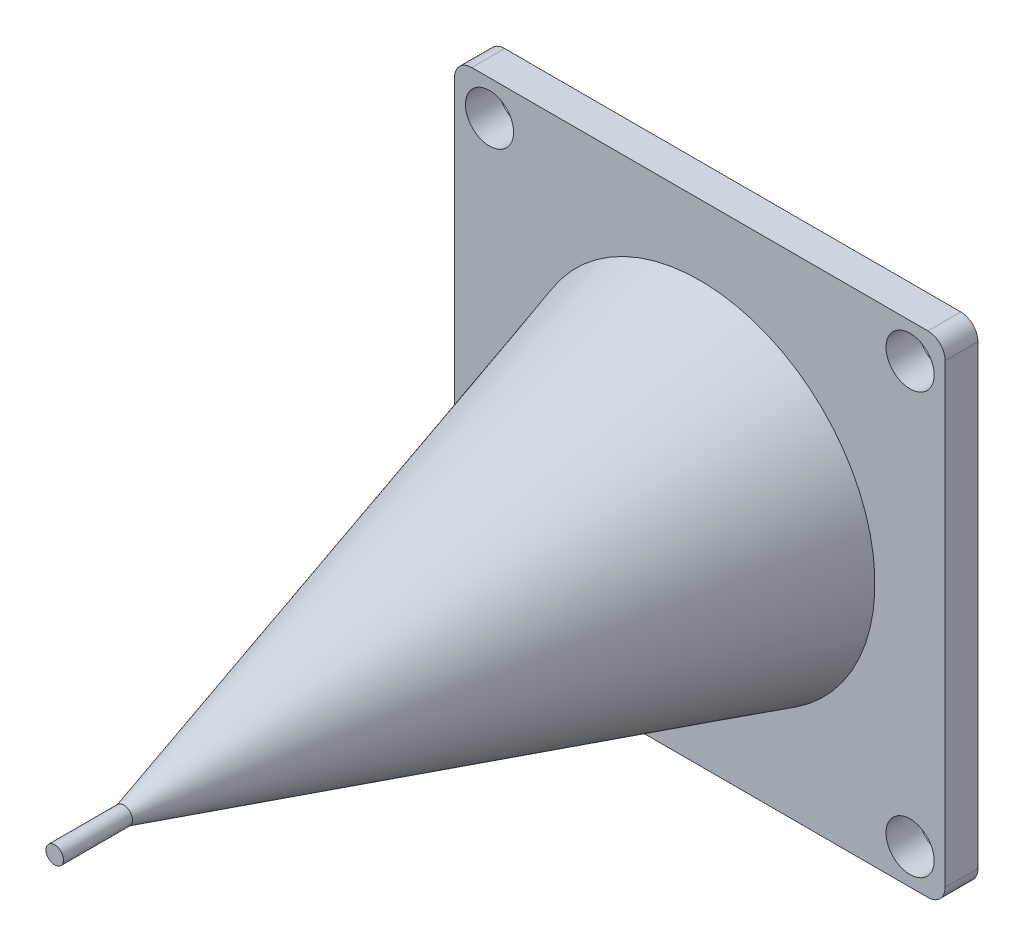
ISO-10303-21;
HEADER;
FILE_DESCRIPTION(('STEP AP214'),'2;1');
FILE_NAME('part.step','',(''),(''),'','','');
FILE_SCHEMA(('AUTOMOTIVE_DESIGN { 1 0 10303 214 1 1 1 1 }'));
ENDSEC;
DATA;
#1=APPLICATION_CONTEXT('core data for automotive mechanical design processes');
#2=APPLICATION_PROTOCOL_DEFINITION('international standard','automotive_design',2000,#1);
#3=PRODUCT_CONTEXT('',#1,'mechanical');
#4=PRODUCT('Part','Part','',(#3));
#5=PRODUCT_RELATED_PRODUCT_CATEGORY('part','',(#4));
#6=PRODUCT_DEFINITION_FORMATION('','',#4);
#7=PRODUCT_DEFINITION_CONTEXT('part definition',#1,'design');
#8=PRODUCT_DEFINITION('design','',#6,#7);
#9=PRODUCT_DEFINITION_SHAPE('','',#8);
#10=(LENGTH_UNIT() NAMED_UNIT(*) SI_UNIT(.MILLI.,.METRE.));
#11=(NAMED_UNIT(*) PLANE_ANGLE_UNIT() SI_UNIT($,.RADIAN.));
#12=(NAMED_UNIT(*) SI_UNIT($,.STERADIAN.) SOLID_ANGLE_UNIT());
#13=UNCERTAINTY_MEASURE_WITH_UNIT(LENGTH_MEASURE(1.E-05),#10,'distance_accuracy_value','');
#14=(GEOMETRIC_REPRESENTATION_CONTEXT(3) GLOBAL_UNCERTAINTY_ASSIGNED_CONTEXT((#13)) GLOBAL_UNIT_ASSIGNED_CONTEXT((#10,
#11,#12)) REPRESENTATION_CONTEXT('',''));
#15=CARTESIAN_POINT('',(0.,0.,0.));
#16=DIRECTION('',(0.,0.,1.));
#17=DIRECTION('',(1.,0.,0.));
#18=AXIS2_PLACEMENT_3D('',#15,#16,#17);
#19=CARTESIAN_POINT('',(-35.56,35.56,4.7625));
#20=DIRECTION('',(1.,0.,0.));
#21=DIRECTION('',(0.,1.,0.));
#22=AXIS2_PLACEMENT_3D('',#19,#20,#21);
#23=PLANE('',#22);
#24=DIRECTION('',(0.,-1.,0.));
#25=VECTOR('',#24,1.);
#26=CARTESIAN_POINT('',(-35.56,35.56,4.7625));
#27=LINE('',#26,#25);
#28=CARTESIAN_POINT('',(-35.56,33.06,4.7625));
#29=VERTEX_POINT('',#28);
#30=CARTESIAN_POINT('',(-35.56,-33.06,4.7625));
#31=VERTEX_POINT('',#30);
#32=EDGE_CURVE('E125',#29,#31,#27,.T.);
#33=ORIENTED_EDGE('',*,*,#32,.F.);
#34=DIRECTION('',(0.,0.,-1.));
#35=VECTOR('',#34,1.);
#36=CARTESIAN_POINT('',(-35.56,33.06,4.7625));
#37=LINE('',#36,#35);
#38=CARTESIAN_POINT('',(-35.56,33.06,0.));
#39=VERTEX_POINT('',#38);
#40=EDGE_CURVE('E110',#29,#39,#37,.T.);
#41=ORIENTED_EDGE('',*,*,#40,.T.);
#42=DIRECTION('',(0.,-1.,0.));
#43=VECTOR('',#42,1.);
#44=CARTESIAN_POINT('',(-35.56,35.56,0.));
#45=LINE('',#44,#43);
#46=CARTESIAN_POINT('',(-35.56,-33.06,0.));
#47=VERTEX_POINT('',#46);
#48=EDGE_CURVE('E122',#39,#47,#45,.T.);
#49=ORIENTED_EDGE('',*,*,#48,.T.);
#50=DIRECTION('',(0.,0.,-1.));
#51=VECTOR('',#50,1.);
#52=CARTESIAN_POINT('',(-35.56,-33.06,4.7625));
#53=LINE('',#52,#51);
#54=EDGE_CURVE('E127',#47,#31,#53,.F.);
#55=ORIENTED_EDGE('',*,*,#54,.T.);
#56=EDGE_LOOP('',(#33,#41,#49,#55));
#57=FACE_BOUND('',#56,.T.);
#58=ADVANCED_FACE('F41',(#57),#23,.F.);
#59=CARTESIAN_POINT('',(-35.56,-35.56,4.7625));
#60=DIRECTION('',(0.,1.,0.));
#61=DIRECTION('',(0.,0.,1.));
#62=AXIS2_PLACEMENT_3D('',#59,#60,#61);
#63=PLANE('',#62);
#64=DIRECTION('',(1.,0.,0.));
#65=VECTOR('',#64,1.);
#66=CARTESIAN_POINT('',(-35.56,-35.56,4.7625));
#67=LINE('',#66,#65);
#68=CARTESIAN_POINT('',(-33.06,-35.56,4.7625));
#69=VERTEX_POINT('',#68);
#70=CARTESIAN_POINT('',(33.06,-35.56,4.7625));
#71=VERTEX_POINT('',#70);
#72=EDGE_CURVE('E180',#69,#71,#67,.T.);
#73=ORIENTED_EDGE('',*,*,#72,.F.);
#74=DIRECTION('',(0.,0.,-1.));
#75=VECTOR('',#74,1.);
#76=CARTESIAN_POINT('',(-33.06,-35.56,4.7625));
#77=LINE('',#76,#75);
#78=CARTESIAN_POINT('',(-33.06,-35.56,0.));
#79=VERTEX_POINT('',#78);
#80=EDGE_CURVE('E164',#69,#79,#77,.T.);
#81=ORIENTED_EDGE('',*,*,#80,.T.);
#82=DIRECTION('',(1.,0.,0.));
#83=VECTOR('',#82,1.);
#84=CARTESIAN_POINT('',(-35.56,-35.56,0.));
#85=LINE('',#84,#83);
#86=CARTESIAN_POINT('',(33.06,-35.56,0.));
#87=VERTEX_POINT('',#86);
#88=EDGE_CURVE('E131',#79,#87,#85,.T.);
#89=ORIENTED_EDGE('',*,*,#88,.T.);
#90=DIRECTION('',(0.,0.,-1.));
#91=VECTOR('',#90,1.);
#92=CARTESIAN_POINT('',(33.06,-35.56,4.7625));
#93=LINE('',#92,#91);
#94=EDGE_CURVE('E162',#87,#71,#93,.F.);
#95=ORIENTED_EDGE('',*,*,#94,.T.);
#96=EDGE_LOOP('',(#73,#81,#89,#95));
#97=FACE_BOUND('',#96,.T.);
#98=ADVANCED_FACE('F238',(#97),#63,.F.);
#99=CARTESIAN_POINT('',(35.56,35.56,4.7625));
#100=DIRECTION('',(-1.,0.,0.));
#101=DIRECTION('',(0.,-1.,0.));
#102=AXIS2_PLACEMENT_3D('',#99,#100,#101);
#103=PLANE('',#102);
#104=DIRECTION('',(0.,1.,0.));
#105=VECTOR('',#104,1.);
#106=CARTESIAN_POINT('',(35.56,35.56,0.));
#107=LINE('',#106,#105);
#108=CARTESIAN_POINT('',(35.56,-33.06,0.));
#109=VERTEX_POINT('',#108);
#110=CARTESIAN_POINT('',(35.56,33.06,0.));
#111=VERTEX_POINT('',#110);
#112=EDGE_CURVE('E135',#109,#111,#107,.T.);
#113=ORIENTED_EDGE('',*,*,#112,.T.);
#114=DIRECTION('',(0.,0.,-1.));
#115=VECTOR('',#114,1.);
#116=CARTESIAN_POINT('',(35.56,33.06,4.7625));
#117=LINE('',#116,#115);
#118=CARTESIAN_POINT('',(35.56,33.06,4.7625));
#119=VERTEX_POINT('',#118);
#120=EDGE_CURVE('E11',#111,#119,#117,.F.);
#121=ORIENTED_EDGE('',*,*,#120,.T.);
#122=DIRECTION('',(0.,1.,0.));
#123=VECTOR('',#122,1.);
#124=CARTESIAN_POINT('',(35.56,35.56,4.7625));
#125=LINE('',#124,#123);
#126=CARTESIAN_POINT('',(35.56,-33.06,4.7625));
#127=VERTEX_POINT('',#126);
#128=EDGE_CURVE('E170',#127,#119,#125,.T.);
#129=ORIENTED_EDGE('',*,*,#128,.F.);
#130=DIRECTION('',(0.,0.,-1.));
#131=VECTOR('',#130,1.);
#132=CARTESIAN_POINT('',(35.56,-33.06,4.7625));
#133=LINE('',#132,#131);
#134=EDGE_CURVE('E49',#127,#109,#133,.T.);
#135=ORIENTED_EDGE('',*,*,#134,.T.);
#136=EDGE_LOOP('',(#113,#121,#129,#135));
#137=FACE_BOUND('',#136,.T.);
#138=ADVANCED_FACE('F169',(#137),#103,.F.);
#139=CARTESIAN_POINT('',(-35.56,35.56,4.7625));
#140=DIRECTION('',(0.,-1.,0.));
#141=DIRECTION('',(0.,0.,-1.));
#142=AXIS2_PLACEMENT_3D('',#139,#140,#141);
#143=PLANE('',#142);
#144=DIRECTION('',(-1.,0.,0.));
#145=VECTOR('',#144,1.);
#146=CARTESIAN_POINT('',(-35.56,35.56,0.));
#147=LINE('',#146,#145);
#148=CARTESIAN_POINT('',(33.06,35.56,0.));
#149=VERTEX_POINT('',#148);
#150=CARTESIAN_POINT('',(-33.06,35.56,0.));
#151=VERTEX_POINT('',#150);
#152=EDGE_CURVE('E145',#149,#151,#147,.T.);
#153=ORIENTED_EDGE('',*,*,#152,.T.);
#154=DIRECTION('',(0.,0.,-1.));
#155=VECTOR('',#154,1.);
#156=CARTESIAN_POINT('',(-33.06,35.56,4.7625));
#157=LINE('',#156,#155);
#158=CARTESIAN_POINT('',(-33.06,35.56,4.7625));
#159=VERTEX_POINT('',#158);
#160=EDGE_CURVE('E111',#151,#159,#157,.F.);
#161=ORIENTED_EDGE('',*,*,#160,.T.);
#162=DIRECTION('',(-1.,0.,0.));
#163=VECTOR('',#162,1.);
#164=CARTESIAN_POINT('',(-35.56,35.56,4.7625));
#165=LINE('',#164,#163);
#166=CARTESIAN_POINT('',(33.06,35.56,4.7625));
#167=VERTEX_POINT('',#166);
#168=EDGE_CURVE('E141',#167,#159,#165,.T.);
#169=ORIENTED_EDGE('',*,*,#168,.F.);
#170=DIRECTION('',(0.,0.,-1.));
#171=VECTOR('',#170,1.);
#172=CARTESIAN_POINT('',(33.06,35.56,4.7625));
#173=LINE('',#172,#171);
#174=EDGE_CURVE('E116',#167,#149,#173,.T.);
#175=ORIENTED_EDGE('',*,*,#174,.T.);
#176=EDGE_LOOP('',(#153,#161,#169,#175));
#177=FACE_BOUND('',#176,.T.);
#178=ADVANCED_FACE('F178',(#177),#143,.F.);
#179=CARTESIAN_POINT('',(0.,0.,4.7625));
#180=DIRECTION('',(0.,0.,1.));
#181=DIRECTION('',(1.,0.,0.));
#182=AXIS2_PLACEMENT_3D('',#179,#180,#181);
#183=PLANE('',#182);
#184=CARTESIAN_POINT('',(0.,0.,4.7625));
#185=DIRECTION('',(0.,0.,1.));
#186=DIRECTION('',(1.,0.,0.));
#187=AXIS2_PLACEMENT_3D('',#184,#185,#186);
#188=CIRCLE('',#187,25.382);
#189=CARTESIAN_POINT('',(-25.382,0.,4.76249999999999));
#190=VERTEX_POINT('',#189);
#191=EDGE_CURVE('E207',#190,#190,#188,.T.);
#192=ORIENTED_EDGE('',*,*,#191,.F.);
#193=EDGE_LOOP('',(#192));
#194=FACE_BOUND('',#193,.T.);
#195=CARTESIAN_POINT('',(-30.48,-30.48,4.7625));
#196=DIRECTION('',(0.,0.,-1.));
#197=DIRECTION('',(1.,0.,0.));
#198=AXIS2_PLACEMENT_3D('',#195,#196,#197);
#199=CIRCLE('',#198,3.4925);
#200=CARTESIAN_POINT('',(-26.9875,-30.48,4.7625));
#201=VERTEX_POINT('',#200);
#202=EDGE_CURVE('E200',#201,#201,#199,.T.);
#203=ORIENTED_EDGE('',*,*,#202,.T.);
#204=EDGE_LOOP('',(#203));
#205=FACE_BOUND('',#204,.T.);
#206=CARTESIAN_POINT('',(30.48,-30.48,4.7625));
#207=DIRECTION('',(0.,0.,-1.));
#208=DIRECTION('',(1.,0.,0.));
#209=AXIS2_PLACEMENT_3D('',#206,#207,#208);
#210=CIRCLE('',#209,3.4925);
#211=CARTESIAN_POINT('',(33.9725,-30.48,4.7625));
#212=VERTEX_POINT('',#211);
#213=EDGE_CURVE('E193',#212,#212,#210,.T.);
#214=ORIENTED_EDGE('',*,*,#213,.T.);
#215=EDGE_LOOP('',(#214));
#216=FACE_BOUND('',#215,.T.);
#217=CARTESIAN_POINT('',(-30.48,30.48,4.7625));
#218=DIRECTION('',(0.,0.,1.));
#219=DIRECTION('',(1.,0.,0.));
#220=AXIS2_PLACEMENT_3D('',#217,#218,#219);
#221=CIRCLE('',#220,3.4925);
#222=CARTESIAN_POINT('',(-26.9875,30.48,4.7625));
#223=VERTEX_POINT('',#222);
#224=EDGE_CURVE('E138',#223,#223,#221,.T.);
#225=ORIENTED_EDGE('',*,*,#224,.F.);
#226=EDGE_LOOP('',(#225));
#227=FACE_BOUND('',#226,.T.);
#228=CARTESIAN_POINT('',(30.48,30.48,4.7625));
#229=DIRECTION('',(0.,0.,1.));
#230=DIRECTION('',(1.,0.,0.));
#231=AXIS2_PLACEMENT_3D('',#228,#229,#230);
#232=CIRCLE('',#231,3.4925);
#233=CARTESIAN_POINT('',(33.9725,30.48,4.7625));
#234=VERTEX_POINT('',#233);
#235=EDGE_CURVE('E184',#234,#234,#232,.T.);
#236=ORIENTED_EDGE('',*,*,#235,.F.);
#237=EDGE_LOOP('',(#236));
#238=FACE_BOUND('',#237,.T.);
#239=ORIENTED_EDGE('',*,*,#168,.T.);
#240=CARTESIAN_POINT('',(-33.06,33.06,4.7625));
#241=DIRECTION('',(0.,0.,1.));
#242=DIRECTION('',(1.,0.,0.));
#243=AXIS2_PLACEMENT_3D('',#240,#241,#242);
#244=CIRCLE('',#243,2.5);
#245=EDGE_CURVE('E160',#159,#29,#244,.T.);
#246=ORIENTED_EDGE('',*,*,#245,.T.);
#247=ORIENTED_EDGE('',*,*,#32,.T.);
#248=CARTESIAN_POINT('',(-33.06,-33.06,4.7625));
#249=DIRECTION('',(0.,0.,1.));
#250=DIRECTION('',(1.,0.,0.));
#251=AXIS2_PLACEMENT_3D('',#248,#249,#250);
#252=CIRCLE('',#251,2.5);
#253=EDGE_CURVE('E158',#31,#69,#252,.T.);
#254=ORIENTED_EDGE('',*,*,#253,.T.);
#255=ORIENTED_EDGE('',*,*,#72,.T.);
#256=CARTESIAN_POINT('',(33.06,-33.06,4.7625));
#257=DIRECTION('',(0.,0.,1.));
#258=DIRECTION('',(1.,0.,0.));
#259=AXIS2_PLACEMENT_3D('',#256,#257,#258);
#260=CIRCLE('',#259,2.5);
#261=EDGE_CURVE('E61',#71,#127,#260,.T.);
#262=ORIENTED_EDGE('',*,*,#261,.T.);
#263=ORIENTED_EDGE('',*,*,#128,.T.);
#264=CARTESIAN_POINT('',(33.06,33.06,4.7625));
#265=DIRECTION('',(0.,0.,1.));
#266=DIRECTION('',(1.,0.,0.));
#267=AXIS2_PLACEMENT_3D('',#264,#265,#266);
#268=CIRCLE('',#267,2.5);
#269=EDGE_CURVE('E156',#119,#167,#268,.T.);
#270=ORIENTED_EDGE('',*,*,#269,.T.);
#271=EDGE_LOOP('',(#239,#246,#247,#254,#255,#262,#263,#270));
#272=FACE_BOUND('',#271,.T.);
#273=ADVANCED_FACE('F258',(#194,#205,#216,#227,#238,#272),#183,.T.);
#274=CARTESIAN_POINT('',(0.,0.,0.));
#275=DIRECTION('',(0.,0.,1.));
#276=DIRECTION('',(1.,0.,0.));
#277=AXIS2_PLACEMENT_3D('',#274,#275,#276);
#278=PLANE('',#277);
#279=CARTESIAN_POINT('',(-30.48,-30.48,0.));
#280=DIRECTION('',(0.,0.,-1.));
#281=DIRECTION('',(1.,0.,0.));
#282=AXIS2_PLACEMENT_3D('',#279,#280,#281);
#283=CIRCLE('',#282,3.4925);
#284=CARTESIAN_POINT('',(-26.9875,-30.48,0.));
#285=VERTEX_POINT('',#284);
#286=EDGE_CURVE('E188',#285,#285,#283,.T.);
#287=ORIENTED_EDGE('',*,*,#286,.F.);
#288=EDGE_LOOP('',(#287));
#289=FACE_BOUND('',#288,.T.);
#290=CARTESIAN_POINT('',(30.48,-30.48,0.));
#291=DIRECTION('',(0.,0.,-1.));
#292=DIRECTION('',(1.,0.,0.));
#293=AXIS2_PLACEMENT_3D('',#290,#291,#292);
#294=CIRCLE('',#293,3.4925);
#295=CARTESIAN_POINT('',(33.9725,-30.48,0.));
#296=VERTEX_POINT('',#295);
#297=EDGE_CURVE('E196',#296,#296,#294,.T.);
#298=ORIENTED_EDGE('',*,*,#297,.F.);
#299=EDGE_LOOP('',(#298));
#300=FACE_BOUND('',#299,.T.);
#301=CARTESIAN_POINT('',(-30.48,30.48,0.));
#302=DIRECTION('',(0.,0.,1.));
#303=DIRECTION('',(1.,0.,0.));
#304=AXIS2_PLACEMENT_3D('',#301,#302,#303);
#305=CIRCLE('',#304,3.4925);
#306=CARTESIAN_POINT('',(-26.9875,30.48,0.));
#307=VERTEX_POINT('',#306);
#308=EDGE_CURVE('E132',#307,#307,#305,.T.);
#309=ORIENTED_EDGE('',*,*,#308,.T.);
#310=EDGE_LOOP('',(#309));
#311=FACE_BOUND('',#310,.T.);
#312=CARTESIAN_POINT('',(30.48,30.48,0.));
#313=DIRECTION('',(0.,0.,1.));
#314=DIRECTION('',(1.,0.,0.));
#315=AXIS2_PLACEMENT_3D('',#312,#313,#314);
#316=CIRCLE('',#315,3.4925);
#317=CARTESIAN_POINT('',(33.9725,30.48,0.));
#318=VERTEX_POINT('',#317);
#319=EDGE_CURVE('E187',#318,#318,#316,.T.);
#320=ORIENTED_EDGE('',*,*,#319,.T.);
#321=EDGE_LOOP('',(#320));
#322=FACE_BOUND('',#321,.T.);
#323=ORIENTED_EDGE('',*,*,#48,.F.);
#324=CARTESIAN_POINT('',(-33.06,33.06,0.));
#325=DIRECTION('',(0.,0.,1.));
#326=DIRECTION('',(1.,0.,0.));
#327=AXIS2_PLACEMENT_3D('',#324,#325,#326);
#328=CIRCLE('',#327,2.5);
#329=EDGE_CURVE('E106',#39,#151,#328,.F.);
#330=ORIENTED_EDGE('',*,*,#329,.T.);
#331=ORIENTED_EDGE('',*,*,#152,.F.);
#332=CARTESIAN_POINT('',(33.06,33.06,0.));
#333=DIRECTION('',(0.,0.,1.));
#334=DIRECTION('',(1.,0.,0.));
#335=AXIS2_PLACEMENT_3D('',#332,#333,#334);
#336=CIRCLE('',#335,2.5);
#337=EDGE_CURVE('E149',#149,#111,#336,.F.);
#338=ORIENTED_EDGE('',*,*,#337,.T.);
#339=ORIENTED_EDGE('',*,*,#112,.F.);
#340=CARTESIAN_POINT('',(33.06,-33.06,0.));
#341=DIRECTION('',(0.,0.,1.));
#342=DIRECTION('',(1.,0.,0.));
#343=AXIS2_PLACEMENT_3D('',#340,#341,#342);
#344=CIRCLE('',#343,2.5);
#345=EDGE_CURVE('E126',#109,#87,#344,.F.);
#346=ORIENTED_EDGE('',*,*,#345,.T.);
#347=ORIENTED_EDGE('',*,*,#88,.F.);
#348=CARTESIAN_POINT('',(-33.06,-33.06,0.));
#349=DIRECTION('',(0.,0.,1.));
#350=DIRECTION('',(1.,0.,0.));
#351=AXIS2_PLACEMENT_3D('',#348,#349,#350);
#352=CIRCLE('',#351,2.5);
#353=EDGE_CURVE('E117',#79,#47,#352,.F.);
#354=ORIENTED_EDGE('',*,*,#353,.T.);
#355=EDGE_LOOP('',(#323,#330,#331,#338,#339,#346,#347,#354));
#356=FACE_BOUND('',#355,.T.);
#357=ADVANCED_FACE('F129',(#289,#300,#311,#322,#356),#278,.F.);
#358=CARTESIAN_POINT('',(30.48,30.48,0.));
#359=DIRECTION('',(0.,0.,1.));
#360=DIRECTION('',(1.,0.,0.));
#361=AXIS2_PLACEMENT_3D('',#358,#359,#360);
#362=CYLINDRICAL_SURFACE('',#361,3.4925);
#363=CARTESIAN_POINT('',(33.9725,30.48,0.));
#364=CARTESIAN_POINT('',(33.9725,30.48,0.049609375));
#365=CARTESIAN_POINT('',(33.9725,30.48,0.09921875));
#366=CARTESIAN_POINT('',(33.9725,30.48,0.1984375));
#367=CARTESIAN_POINT('',(33.9725,30.48,0.248046875));
#368=CARTESIAN_POINT('',(33.9725,30.48,0.347265625));
#369=CARTESIAN_POINT('',(33.9725,30.48,0.396875));
#370=CARTESIAN_POINT('',(33.9725,30.48,0.49609375));
#371=CARTESIAN_POINT('',(33.9725,30.48,0.545703125));
#372=CARTESIAN_POINT('',(33.9725,30.48,0.644921875));
#373=CARTESIAN_POINT('',(33.9725,30.48,0.69453125));
#374=CARTESIAN_POINT('',(33.9725,30.48,0.79375));
#375=CARTESIAN_POINT('',(33.9725,30.48,0.843359375));
#376=CARTESIAN_POINT('',(33.9725,30.48,0.942578125));
#377=CARTESIAN_POINT('',(33.9725,30.48,0.9921875));
#378=CARTESIAN_POINT('',(33.9725,30.48,1.09140625));
#379=CARTESIAN_POINT('',(33.9725,30.48,1.141015625));
#380=CARTESIAN_POINT('',(33.9725,30.48,1.240234375));
#381=CARTESIAN_POINT('',(33.9725,30.48,1.28984375));
#382=CARTESIAN_POINT('',(33.9725,30.48,1.3890625));
#383=CARTESIAN_POINT('',(33.9725,30.48,1.438671875));
#384=CARTESIAN_POINT('',(33.9725,30.48,1.537890625));
#385=CARTESIAN_POINT('',(33.9725,30.48,1.5875));
#386=CARTESIAN_POINT('',(33.9725,30.48,1.68671875));
#387=CARTESIAN_POINT('',(33.9725,30.48,1.736328125));
#388=CARTESIAN_POINT('',(33.9725,30.48,1.835546875));
#389=CARTESIAN_POINT('',(33.9725,30.48,1.88515625));
#390=CARTESIAN_POINT('',(33.9725,30.48,1.984375));
#391=CARTESIAN_POINT('',(33.9725,30.48,2.033984375));
#392=CARTESIAN_POINT('',(33.9725,30.48,2.133203125));
#393=CARTESIAN_POINT('',(33.9725,30.48,2.1828125));
#394=CARTESIAN_POINT('',(33.9725,30.48,2.28203125));
#395=CARTESIAN_POINT('',(33.9725,30.48,2.331640625));
#396=CARTESIAN_POINT('',(33.9725,30.48,2.430859375));
#397=CARTESIAN_POINT('',(33.9725,30.48,2.48046875));
#398=CARTESIAN_POINT('',(33.9725,30.48,2.5796875));
#399=CARTESIAN_POINT('',(33.9725,30.48,2.629296875));
#400=CARTESIAN_POINT('',(33.9725,30.48,2.728515625));
#401=CARTESIAN_POINT('',(33.9725,30.48,2.778125));
#402=CARTESIAN_POINT('',(33.9725,30.48,2.87734375));
#403=CARTESIAN_POINT('',(33.9725,30.48,2.926953125));
#404=CARTESIAN_POINT('',(33.9725,30.48,3.026171875));
#405=CARTESIAN_POINT('',(33.9725,30.48,3.07578125));
#406=CARTESIAN_POINT('',(33.9725,30.48,3.175));
#407=CARTESIAN_POINT('',(33.9725,30.48,3.224609375));
#408=CARTESIAN_POINT('',(33.9725,30.48,3.323828125));
#409=CARTESIAN_POINT('',(33.9725,30.48,3.3734375));
#410=CARTESIAN_POINT('',(33.9725,30.48,3.47265625));
#411=CARTESIAN_POINT('',(33.9725,30.48,3.522265625));
#412=CARTESIAN_POINT('',(33.9725,30.48,3.621484375));
#413=CARTESIAN_POINT('',(33.9725,30.48,3.67109375));
#414=CARTESIAN_POINT('',(33.9725,30.48,3.7703125));
#415=CARTESIAN_POINT('',(33.9725,30.48,3.819921875));
#416=CARTESIAN_POINT('',(33.9725,30.48,3.919140625));
#417=CARTESIAN_POINT('',(33.9725,30.48,3.96875));
#418=CARTESIAN_POINT('',(33.9725,30.48,4.06796875));
#419=CARTESIAN_POINT('',(33.9725,30.48,4.117578125));
#420=CARTESIAN_POINT('',(33.9725,30.48,4.216796875));
#421=CARTESIAN_POINT('',(33.9725,30.48,4.26640625));
#422=CARTESIAN_POINT('',(33.9725,30.48,4.365625));
#423=CARTESIAN_POINT('',(33.9725,30.48,4.415234375));
#424=CARTESIAN_POINT('',(33.9725,30.48,4.514453125));
#425=CARTESIAN_POINT('',(33.9725,30.48,4.5640625));
#426=CARTESIAN_POINT('',(33.9725,30.48,4.66328125));
#427=CARTESIAN_POINT('',(33.9725,30.48,4.712890625));
#428=CARTESIAN_POINT('',(33.9725,30.48,4.7625));
#429=B_SPLINE_CURVE_WITH_KNOTS('',3,(#363,#364,#365,#366,#367,#368,#369,#370,#371,#372,#373,
#374,#375,#376,#377,#378,#379,#380,#381,#382,#383,#384,#385,#386,#387,#388,#389,#390,#391,#392,
#393,#394,#395,#396,#397,#398,#399,#400,#401,#402,#403,#404,#405,#406,#407,#408,#409,#410,#411,
#412,#413,#414,#415,#416,#417,#418,#419,#420,#421,#422,#423,#424,#425,#426,#427,#428),
.UNSPECIFIED.,.F.,.F.,(4,2,2,2,2,2,2,2,2,2,2,2,2,2,2,2,2,2,2,2,2,2,2,2,2,2,2,2,2,2,2,2,4),(0.,
0.148828125,0.29765625,0.446484375,0.5953125,0.744140625,0.89296875,1.041796875,1.190625,
1.339453125,1.48828125,1.637109375,1.7859375,1.934765625,2.08359375,2.232421875,2.38125,
2.530078125,2.67890625,2.827734375,2.9765625,3.125390625,3.27421875,3.423046875,3.571875,
3.720703125,3.86953125,4.018359375,4.1671875,4.316015625,4.46484375,4.613671875,4.7625),.UNSPECIFIED.);
#430=EDGE_CURVE('BSEAM267',#318,#234,#429,.T.);
#431=ORIENTED_EDGE('',*,*,#319,.F.);
#432=ORIENTED_EDGE('',*,*,#235,.T.);
#433=ORIENTED_EDGE('',*,*,#430,.T.);
#434=ORIENTED_EDGE('',*,*,#430,.F.);
#435=EDGE_LOOP('',(#431,#433,#432,#434));
#436=FACE_BOUND('',#435,.T.);
#437=ADVANCED_FACE('F267',(#436),#362,.F.);
#438=CARTESIAN_POINT('',(-30.48,30.48,0.));
#439=DIRECTION('',(0.,0.,1.));
#440=DIRECTION('',(1.,0.,0.));
#441=AXIS2_PLACEMENT_3D('',#438,#439,#440);
#442=CYLINDRICAL_SURFACE('',#441,3.4925);
#443=CARTESIAN_POINT('',(-26.9875,30.48,0.));
#444=CARTESIAN_POINT('',(-26.9875,30.48,0.049609375));
#445=CARTESIAN_POINT('',(-26.9875,30.48,0.09921875));
#446=CARTESIAN_POINT('',(-26.9875,30.48,0.1984375));
#447=CARTESIAN_POINT('',(-26.9875,30.48,0.248046875));
#448=CARTESIAN_POINT('',(-26.9875,30.48,0.347265625));
#449=CARTESIAN_POINT('',(-26.9875,30.48,0.396875));
#450=CARTESIAN_POINT('',(-26.9875,30.48,0.49609375));
#451=CARTESIAN_POINT('',(-26.9875,30.48,0.545703125));
#452=CARTESIAN_POINT('',(-26.9875,30.48,0.644921875));
#453=CARTESIAN_POINT('',(-26.9875,30.48,0.69453125));
#454=CARTESIAN_POINT('',(-26.9875,30.48,0.79375));
#455=CARTESIAN_POINT('',(-26.9875,30.48,0.843359375));
#456=CARTESIAN_POINT('',(-26.9875,30.48,0.942578125));
#457=CARTESIAN_POINT('',(-26.9875,30.48,0.9921875));
#458=CARTESIAN_POINT('',(-26.9875,30.48,1.09140625));
#459=CARTESIAN_POINT('',(-26.9875,30.48,1.141015625));
#460=CARTESIAN_POINT('',(-26.9875,30.48,1.240234375));
#461=CARTESIAN_POINT('',(-26.9875,30.48,1.28984375));
#462=CARTESIAN_POINT('',(-26.9875,30.48,1.3890625));
#463=CARTESIAN_POINT('',(-26.9875,30.48,1.438671875));
#464=CARTESIAN_POINT('',(-26.9875,30.48,1.537890625));
#465=CARTESIAN_POINT('',(-26.9875,30.48,1.5875));
#466=CARTESIAN_POINT('',(-26.9875,30.48,1.68671875));
#467=CARTESIAN_POINT('',(-26.9875,30.48,1.736328125));
#468=CARTESIAN_POINT('',(-26.9875,30.48,1.835546875));
#469=CARTESIAN_POINT('',(-26.9875,30.48,1.88515625));
#470=CARTESIAN_POINT('',(-26.9875,30.48,1.984375));
#471=CARTESIAN_POINT('',(-26.9875,30.48,2.033984375));
#472=CARTESIAN_POINT('',(-26.9875,30.48,2.133203125));
#473=CARTESIAN_POINT('',(-26.9875,30.48,2.1828125));
#474=CARTESIAN_POINT('',(-26.9875,30.48,2.28203125));
#475=CARTESIAN_POINT('',(-26.9875,30.48,2.331640625));
#476=CARTESIAN_POINT('',(-26.9875,30.48,2.430859375));
#477=CARTESIAN_POINT('',(-26.9875,30.48,2.48046875));
#478=CARTESIAN_POINT('',(-26.9875,30.48,2.5796875));
#479=CARTESIAN_POINT('',(-26.9875,30.48,2.629296875));
#480=CARTESIAN_POINT('',(-26.9875,30.48,2.728515625));
#481=CARTESIAN_POINT('',(-26.9875,30.48,2.778125));
#482=CARTESIAN_POINT('',(-26.9875,30.48,2.87734375));
#483=CARTESIAN_POINT('',(-26.9875,30.48,2.926953125));
#484=CARTESIAN_POINT('',(-26.9875,30.48,3.026171875));
#485=CARTESIAN_POINT('',(-26.9875,30.48,3.07578125));
#486=CARTESIAN_POINT('',(-26.9875,30.48,3.175));
#487=CARTESIAN_POINT('',(-26.9875,30.48,3.224609375));
#488=CARTESIAN_POINT('',(-26.9875,30.48,3.323828125));
#489=CARTESIAN_POINT('',(-26.9875,30.48,3.3734375));
#490=CARTESIAN_POINT('',(-26.9875,30.48,3.47265625));
#491=CARTESIAN_POINT('',(-26.9875,30.48,3.522265625));
#492=CARTESIAN_POINT('',(-26.9875,30.48,3.621484375));
#493=CARTESIAN_POINT('',(-26.9875,30.48,3.67109375));
#494=CARTESIAN_POINT('',(-26.9875,30.48,3.7703125));
#495=CARTESIAN_POINT('',(-26.9875,30.48,3.819921875));
#496=CARTESIAN_POINT('',(-26.9875,30.48,3.919140625));
#497=CARTESIAN_POINT('',(-26.9875,30.48,3.96875));
#498=CARTESIAN_POINT('',(-26.9875,30.48,4.06796875));
#499=CARTESIAN_POINT('',(-26.9875,30.48,4.117578125));
#500=CARTESIAN_POINT('',(-26.9875,30.48,4.216796875));
#501=CARTESIAN_POINT('',(-26.9875,30.48,4.26640625));
#502=CARTESIAN_POINT('',(-26.9875,30.48,4.365625));
#503=CARTESIAN_POINT('',(-26.9875,30.48,4.415234375));
#504=CARTESIAN_POINT('',(-26.9875,30.48,4.514453125));
#505=CARTESIAN_POINT('',(-26.9875,30.48,4.5640625));
#506=CARTESIAN_POINT('',(-26.9875,30.48,4.66328125));
#507=CARTESIAN_POINT('',(-26.9875,30.48,4.712890625));
#508=CARTESIAN_POINT('',(-26.9875,30.48,4.7625));
#509=B_SPLINE_CURVE_WITH_KNOTS('',3,(#443,#444,#445,#446,#447,#448,#449,#450,#451,#452,#453,
#454,#455,#456,#457,#458,#459,#460,#461,#462,#463,#464,#465,#466,#467,#468,#469,#470,#471,#472,
#473,#474,#475,#476,#477,#478,#479,#480,#481,#482,#483,#484,#485,#486,#487,#488,#489,#490,#491,
#492,#493,#494,#495,#496,#497,#498,#499,#500,#501,#502,#503,#504,#505,#506,#507,#508),
.UNSPECIFIED.,.F.,.F.,(4,2,2,2,2,2,2,2,2,2,2,2,2,2,2,2,2,2,2,2,2,2,2,2,2,2,2,2,2,2,2,2,4),(0.,
0.148828125,0.29765625,0.446484375,0.5953125,0.744140625,0.89296875,1.041796875,1.190625,
1.339453125,1.48828125,1.637109375,1.7859375,1.934765625,2.08359375,2.232421875,2.38125,
2.530078125,2.67890625,2.827734375,2.9765625,3.125390625,3.27421875,3.423046875,3.571875,
3.720703125,3.86953125,4.018359375,4.1671875,4.316015625,4.46484375,4.613671875,4.7625),.UNSPECIFIED.);
#510=EDGE_CURVE('BSEAM358',#307,#223,#509,.T.);
#511=ORIENTED_EDGE('',*,*,#308,.F.);
#512=ORIENTED_EDGE('',*,*,#224,.T.);
#513=ORIENTED_EDGE('',*,*,#510,.T.);
#514=ORIENTED_EDGE('',*,*,#510,.F.);
#515=EDGE_LOOP('',(#511,#513,#512,#514));
#516=FACE_BOUND('',#515,.T.);
#517=ADVANCED_FACE('F358',(#516),#442,.F.);
#518=CARTESIAN_POINT('',(30.48,-30.48,0.));
#519=DIRECTION('',(0.,0.,1.));
#520=DIRECTION('',(1.,0.,0.));
#521=AXIS2_PLACEMENT_3D('',#518,#519,#520);
#522=CYLINDRICAL_SURFACE('',#521,3.4925);
#523=CARTESIAN_POINT('',(33.9725,-30.48,0.));
#524=CARTESIAN_POINT('',(33.9725,-30.48,0.049609375));
#525=CARTESIAN_POINT('',(33.9725,-30.48,0.09921875));
#526=CARTESIAN_POINT('',(33.9725,-30.48,0.1984375));
#527=CARTESIAN_POINT('',(33.9725,-30.48,0.248046875));
#528=CARTESIAN_POINT('',(33.9725,-30.48,0.347265625));
#529=CARTESIAN_POINT('',(33.9725,-30.48,0.396875));
#530=CARTESIAN_POINT('',(33.9725,-30.48,0.49609375));
#531=CARTESIAN_POINT('',(33.9725,-30.48,0.545703125));
#532=CARTESIAN_POINT('',(33.9725,-30.48,0.644921875));
#533=CARTESIAN_POINT('',(33.9725,-30.48,0.69453125));
#534=CARTESIAN_POINT('',(33.9725,-30.48,0.79375));
#535=CARTESIAN_POINT('',(33.9725,-30.48,0.843359375));
#536=CARTESIAN_POINT('',(33.9725,-30.48,0.942578125));
#537=CARTESIAN_POINT('',(33.9725,-30.48,0.9921875));
#538=CARTESIAN_POINT('',(33.9725,-30.48,1.09140625));
#539=CARTESIAN_POINT('',(33.9725,-30.48,1.141015625));
#540=CARTESIAN_POINT('',(33.9725,-30.48,1.240234375));
#541=CARTESIAN_POINT('',(33.9725,-30.48,1.28984375));
#542=CARTESIAN_POINT('',(33.9725,-30.48,1.3890625));
#543=CARTESIAN_POINT('',(33.9725,-30.48,1.438671875));
#544=CARTESIAN_POINT('',(33.9725,-30.48,1.537890625));
#545=CARTESIAN_POINT('',(33.9725,-30.48,1.5875));
#546=CARTESIAN_POINT('',(33.9725,-30.48,1.68671875));
#547=CARTESIAN_POINT('',(33.9725,-30.48,1.736328125));
#548=CARTESIAN_POINT('',(33.9725,-30.48,1.835546875));
#549=CARTESIAN_POINT('',(33.9725,-30.48,1.88515625));
#550=CARTESIAN_POINT('',(33.9725,-30.48,1.984375));
#551=CARTESIAN_POINT('',(33.9725,-30.48,2.033984375));
#552=CARTESIAN_POINT('',(33.9725,-30.48,2.133203125));
#553=CARTESIAN_POINT('',(33.9725,-30.48,2.1828125));
#554=CARTESIAN_POINT('',(33.9725,-30.48,2.28203125));
#555=CARTESIAN_POINT('',(33.9725,-30.48,2.331640625));
#556=CARTESIAN_POINT('',(33.9725,-30.48,2.430859375));
#557=CARTESIAN_POINT('',(33.9725,-30.48,2.48046875));
#558=CARTESIAN_POINT('',(33.9725,-30.48,2.5796875));
#559=CARTESIAN_POINT('',(33.9725,-30.48,2.629296875));
#560=CARTESIAN_POINT('',(33.9725,-30.48,2.728515625));
#561=CARTESIAN_POINT('',(33.9725,-30.48,2.778125));
#562=CARTESIAN_POINT('',(33.9725,-30.48,2.87734375));
#563=CARTESIAN_POINT('',(33.9725,-30.48,2.926953125));
#564=CARTESIAN_POINT('',(33.9725,-30.48,3.026171875));
#565=CARTESIAN_POINT('',(33.9725,-30.48,3.07578125));
#566=CARTESIAN_POINT('',(33.9725,-30.48,3.175));
#567=CARTESIAN_POINT('',(33.9725,-30.48,3.224609375));
#568=CARTESIAN_POINT('',(33.9725,-30.48,3.323828125));
#569=CARTESIAN_POINT('',(33.9725,-30.48,3.3734375));
#570=CARTESIAN_POINT('',(33.9725,-30.48,3.47265625));
#571=CARTESIAN_POINT('',(33.9725,-30.48,3.522265625));
#572=CARTESIAN_POINT('',(33.9725,-30.48,3.621484375));
#573=CARTESIAN_POINT('',(33.9725,-30.48,3.67109375));
#574=CARTESIAN_POINT('',(33.9725,-30.48,3.7703125));
#575=CARTESIAN_POINT('',(33.9725,-30.48,3.819921875));
#576=CARTESIAN_POINT('',(33.9725,-30.48,3.919140625));
#577=CARTESIAN_POINT('',(33.9725,-30.48,3.96875));
#578=CARTESIAN_POINT('',(33.9725,-30.48,4.06796875));
#579=CARTESIAN_POINT('',(33.9725,-30.48,4.117578125));
#580=CARTESIAN_POINT('',(33.9725,-30.48,4.216796875));
#581=CARTESIAN_POINT('',(33.9725,-30.48,4.26640625));
#582=CARTESIAN_POINT('',(33.9725,-30.48,4.365625));
#583=CARTESIAN_POINT('',(33.9725,-30.48,4.415234375));
#584=CARTESIAN_POINT('',(33.9725,-30.48,4.514453125));
#585=CARTESIAN_POINT('',(33.9725,-30.48,4.5640625));
#586=CARTESIAN_POINT('',(33.9725,-30.48,4.66328125));
#587=CARTESIAN_POINT('',(33.9725,-30.48,4.712890625));
#588=CARTESIAN_POINT('',(33.9725,-30.48,4.7625));
#589=B_SPLINE_CURVE_WITH_KNOTS('',3,(#523,#524,#525,#526,#527,#528,#529,#530,#531,#532,#533,
#534,#535,#536,#537,#538,#539,#540,#541,#542,#543,#544,#545,#546,#547,#548,#549,#550,#551,#552,
#553,#554,#555,#556,#557,#558,#559,#560,#561,#562,#563,#564,#565,#566,#567,#568,#569,#570,#571,
#572,#573,#574,#575,#576,#577,#578,#579,#580,#581,#582,#583,#584,#585,#586,#587,#588),
.UNSPECIFIED.,.F.,.F.,(4,2,2,2,2,2,2,2,2,2,2,2,2,2,2,2,2,2,2,2,2,2,2,2,2,2,2,2,2,2,2,2,4),(0.,
0.148828125,0.29765625,0.446484375,0.5953125,0.744140625,0.89296875,1.041796875,1.190625,
1.339453125,1.48828125,1.637109375,1.7859375,1.934765625,2.08359375,2.232421875,2.38125,
2.530078125,2.67890625,2.827734375,2.9765625,3.125390625,3.27421875,3.423046875,3.571875,
3.720703125,3.86953125,4.018359375,4.1671875,4.316015625,4.46484375,4.613671875,4.7625),.UNSPECIFIED.);
#590=EDGE_CURVE('BSEAM349',#296,#212,#589,.T.);
#591=ORIENTED_EDGE('',*,*,#297,.T.);
#592=ORIENTED_EDGE('',*,*,#213,.F.);
#593=ORIENTED_EDGE('',*,*,#590,.T.);
#594=ORIENTED_EDGE('',*,*,#590,.F.);
#595=EDGE_LOOP('',(#591,#593,#592,#594));
#596=FACE_BOUND('',#595,.T.);
#597=ADVANCED_FACE('F349',(#596),#522,.F.);
#598=CARTESIAN_POINT('',(-30.48,-30.48,0.));
#599=DIRECTION('',(0.,0.,1.));
#600=DIRECTION('',(1.,0.,0.));
#601=AXIS2_PLACEMENT_3D('',#598,#599,#600);
#602=CYLINDRICAL_SURFACE('',#601,3.4925);
#603=CARTESIAN_POINT('',(-26.9875,-30.48,0.));
#604=CARTESIAN_POINT('',(-26.9875,-30.48,0.049609375));
#605=CARTESIAN_POINT('',(-26.9875,-30.48,0.09921875));
#606=CARTESIAN_POINT('',(-26.9875,-30.48,0.1984375));
#607=CARTESIAN_POINT('',(-26.9875,-30.48,0.248046875));
#608=CARTESIAN_POINT('',(-26.9875,-30.48,0.347265625));
#609=CARTESIAN_POINT('',(-26.9875,-30.48,0.396875));
#610=CARTESIAN_POINT('',(-26.9875,-30.48,0.49609375));
#611=CARTESIAN_POINT('',(-26.9875,-30.48,0.545703125));
#612=CARTESIAN_POINT('',(-26.9875,-30.48,0.644921875));
#613=CARTESIAN_POINT('',(-26.9875,-30.48,0.69453125));
#614=CARTESIAN_POINT('',(-26.9875,-30.48,0.79375));
#615=CARTESIAN_POINT('',(-26.9875,-30.48,0.843359375));
#616=CARTESIAN_POINT('',(-26.9875,-30.48,0.942578125));
#617=CARTESIAN_POINT('',(-26.9875,-30.48,0.9921875));
#618=CARTESIAN_POINT('',(-26.9875,-30.48,1.09140625));
#619=CARTESIAN_POINT('',(-26.9875,-30.48,1.141015625));
#620=CARTESIAN_POINT('',(-26.9875,-30.48,1.240234375));
#621=CARTESIAN_POINT('',(-26.9875,-30.48,1.28984375));
#622=CARTESIAN_POINT('',(-26.9875,-30.48,1.3890625));
#623=CARTESIAN_POINT('',(-26.9875,-30.48,1.438671875));
#624=CARTESIAN_POINT('',(-26.9875,-30.48,1.537890625));
#625=CARTESIAN_POINT('',(-26.9875,-30.48,1.5875));
#626=CARTESIAN_POINT('',(-26.9875,-30.48,1.68671875));
#627=CARTESIAN_POINT('',(-26.9875,-30.48,1.736328125));
#628=CARTESIAN_POINT('',(-26.9875,-30.48,1.835546875));
#629=CARTESIAN_POINT('',(-26.9875,-30.48,1.88515625));
#630=CARTESIAN_POINT('',(-26.9875,-30.48,1.984375));
#631=CARTESIAN_POINT('',(-26.9875,-30.48,2.033984375));
#632=CARTESIAN_POINT('',(-26.9875,-30.48,2.133203125));
#633=CARTESIAN_POINT('',(-26.9875,-30.48,2.1828125));
#634=CARTESIAN_POINT('',(-26.9875,-30.48,2.28203125));
#635=CARTESIAN_POINT('',(-26.9875,-30.48,2.331640625));
#636=CARTESIAN_POINT('',(-26.9875,-30.48,2.430859375));
#637=CARTESIAN_POINT('',(-26.9875,-30.48,2.48046875));
#638=CARTESIAN_POINT('',(-26.9875,-30.48,2.5796875));
#639=CARTESIAN_POINT('',(-26.9875,-30.48,2.629296875));
#640=CARTESIAN_POINT('',(-26.9875,-30.48,2.728515625));
#641=CARTESIAN_POINT('',(-26.9875,-30.48,2.778125));
#642=CARTESIAN_POINT('',(-26.9875,-30.48,2.87734375));
#643=CARTESIAN_POINT('',(-26.9875,-30.48,2.926953125));
#644=CARTESIAN_POINT('',(-26.9875,-30.48,3.026171875));
#645=CARTESIAN_POINT('',(-26.9875,-30.48,3.07578125));
#646=CARTESIAN_POINT('',(-26.9875,-30.48,3.175));
#647=CARTESIAN_POINT('',(-26.9875,-30.48,3.224609375));
#648=CARTESIAN_POINT('',(-26.9875,-30.48,3.323828125));
#649=CARTESIAN_POINT('',(-26.9875,-30.48,3.3734375));
#650=CARTESIAN_POINT('',(-26.9875,-30.48,3.47265625));
#651=CARTESIAN_POINT('',(-26.9875,-30.48,3.522265625));
#652=CARTESIAN_POINT('',(-26.9875,-30.48,3.621484375));
#653=CARTESIAN_POINT('',(-26.9875,-30.48,3.67109375));
#654=CARTESIAN_POINT('',(-26.9875,-30.48,3.7703125));
#655=CARTESIAN_POINT('',(-26.9875,-30.48,3.819921875));
#656=CARTESIAN_POINT('',(-26.9875,-30.48,3.919140625));
#657=CARTESIAN_POINT('',(-26.9875,-30.48,3.96875));
#658=CARTESIAN_POINT('',(-26.9875,-30.48,4.06796875));
#659=CARTESIAN_POINT('',(-26.9875,-30.48,4.117578125));
#660=CARTESIAN_POINT('',(-26.9875,-30.48,4.216796875));
#661=CARTESIAN_POINT('',(-26.9875,-30.48,4.26640625));
#662=CARTESIAN_POINT('',(-26.9875,-30.48,4.365625));
#663=CARTESIAN_POINT('',(-26.9875,-30.48,4.415234375));
#664=CARTESIAN_POINT('',(-26.9875,-30.48,4.514453125));
#665=CARTESIAN_POINT('',(-26.9875,-30.48,4.5640625));
#666=CARTESIAN_POINT('',(-26.9875,-30.48,4.66328125));
#667=CARTESIAN_POINT('',(-26.9875,-30.48,4.712890625));
#668=CARTESIAN_POINT('',(-26.9875,-30.48,4.7625));
#669=B_SPLINE_CURVE_WITH_KNOTS('',3,(#603,#604,#605,#606,#607,#608,#609,#610,#611,#612,#613,
#614,#615,#616,#617,#618,#619,#620,#621,#622,#623,#624,#625,#626,#627,#628,#629,#630,#631,#632,
#633,#634,#635,#636,#637,#638,#639,#640,#641,#642,#643,#644,#645,#646,#647,#648,#649,#650,#651,
#652,#653,#654,#655,#656,#657,#658,#659,#660,#661,#662,#663,#664,#665,#666,#667,#668),
.UNSPECIFIED.,.F.,.F.,(4,2,2,2,2,2,2,2,2,2,2,2,2,2,2,2,2,2,2,2,2,2,2,2,2,2,2,2,2,2,2,2,4),(0.,
0.148828125,0.29765625,0.446484375,0.5953125,0.744140625,0.89296875,1.041796875,1.190625,
1.339453125,1.48828125,1.637109375,1.7859375,1.934765625,2.08359375,2.232421875,2.38125,
2.530078125,2.67890625,2.827734375,2.9765625,3.125390625,3.27421875,3.423046875,3.571875,
3.720703125,3.86953125,4.018359375,4.1671875,4.316015625,4.46484375,4.613671875,4.7625),.UNSPECIFIED.);
#670=EDGE_CURVE('BSEAM340',#285,#201,#669,.T.);
#671=ORIENTED_EDGE('',*,*,#286,.T.);
#672=ORIENTED_EDGE('',*,*,#202,.F.);
#673=ORIENTED_EDGE('',*,*,#670,.T.);
#674=ORIENTED_EDGE('',*,*,#670,.F.);
#675=EDGE_LOOP('',(#671,#673,#672,#674));
#676=FACE_BOUND('',#675,.T.);
#677=ADVANCED_FACE('F340',(#676),#602,.F.);
#678=CARTESIAN_POINT('',(0.,0.,88.2625));
#679=DIRECTION('',(0.,0.,-1.));
#680=DIRECTION('',(-1.,0.,0.));
#681=AXIS2_PLACEMENT_3D('',#678,#679,#680);
#682=CONICAL_SURFACE('',#681,1.245,0.281395541170508);
#683=CARTESIAN_POINT('',(0.,0.,88.2625));
#684=DIRECTION('',(0.,0.,1.));
#685=DIRECTION('',(1.,0.,0.));
#686=AXIS2_PLACEMENT_3D('',#683,#684,#685);
#687=CIRCLE('',#686,1.245);
#688=CARTESIAN_POINT('',(-1.245,0.,88.2625));
#689=VERTEX_POINT('',#688);
#690=EDGE_CURVE('E197',#689,#689,#687,.T.);
#691=CARTESIAN_POINT('',(-25.382,0.,4.76249999999999));
#692=CARTESIAN_POINT('',(-25.1305729166667,0.,5.63229166666665));
#693=CARTESIAN_POINT('',(-24.8791458333333,0.,6.50208333333332));
#694=CARTESIAN_POINT('',(-24.3762916666667,0.,8.24166666666665));
#695=CARTESIAN_POINT('',(-24.1248645833333,0.,9.11145833333332));
#696=CARTESIAN_POINT('',(-23.6220104166667,0.,10.8510416666667));
#697=CARTESIAN_POINT('',(-23.3705833333333,0.,11.7208333333333));
#698=CARTESIAN_POINT('',(-22.8677291666667,0.,13.4604166666667));
#699=CARTESIAN_POINT('',(-22.6163020833333,0.,14.3302083333333));
#700=CARTESIAN_POINT('',(-22.1134479166667,0.,16.0697916666667));
#701=CARTESIAN_POINT('',(-21.8620208333333,0.,16.9395833333333));
#702=CARTESIAN_POINT('',(-21.3591666666667,0.,18.6791666666667));
#703=CARTESIAN_POINT('',(-21.1077395833333,0.,19.5489583333333));
#704=CARTESIAN_POINT('',(-20.6048854166667,0.,21.2885416666667));
#705=CARTESIAN_POINT('',(-20.3534583333333,0.,22.1583333333333));
#706=CARTESIAN_POINT('',(-19.8506041666667,0.,23.8979166666667));
#707=CARTESIAN_POINT('',(-19.5991770833333,0.,24.7677083333333));
#708=CARTESIAN_POINT('',(-19.0963229166667,0.,26.5072916666667));
#709=CARTESIAN_POINT('',(-18.8448958333333,0.,27.3770833333333));
#710=CARTESIAN_POINT('',(-18.3420416666667,0.,29.1166666666667));
#711=CARTESIAN_POINT('',(-18.0906145833333,0.,29.9864583333333));
#712=CARTESIAN_POINT('',(-17.5877604166667,0.,31.7260416666667));
#713=CARTESIAN_POINT('',(-17.3363333333333,0.,32.5958333333333));
#714=CARTESIAN_POINT('',(-16.8334791666667,0.,34.3354166666667));
#715=CARTESIAN_POINT('',(-16.5820520833333,0.,35.2052083333333));
#716=CARTESIAN_POINT('',(-16.0791979166667,0.,36.9447916666667));
#717=CARTESIAN_POINT('',(-15.8277708333333,0.,37.8145833333333));
#718=CARTESIAN_POINT('',(-15.3249166666667,0.,39.5541666666667));
#719=CARTESIAN_POINT('',(-15.0734895833333,0.,40.4239583333333));
#720=CARTESIAN_POINT('',(-14.5706354166667,0.,42.1635416666667));
#721=CARTESIAN_POINT('',(-14.3192083333333,0.,43.0333333333333));
#722=CARTESIAN_POINT('',(-13.8163541666667,0.,44.7729166666667));
#723=CARTESIAN_POINT('',(-13.5649270833333,0.,45.6427083333333));
#724=CARTESIAN_POINT('',(-13.0620729166667,0.,47.3822916666667));
#725=CARTESIAN_POINT('',(-12.8106458333333,0.,48.2520833333333));
#726=CARTESIAN_POINT('',(-12.3077916666667,0.,49.9916666666667));
#727=CARTESIAN_POINT('',(-12.0563645833333,0.,50.8614583333333));
#728=CARTESIAN_POINT('',(-11.5535104166667,0.,52.6010416666667));
#729=CARTESIAN_POINT('',(-11.3020833333333,0.,53.4708333333333));
#730=CARTESIAN_POINT('',(-10.7992291666667,0.,55.2104166666667));
#731=CARTESIAN_POINT('',(-10.5478020833333,0.,56.0802083333333));
#732=CARTESIAN_POINT('',(-10.0449479166667,0.,57.8197916666667));
#733=CARTESIAN_POINT('',(-9.79352083333334,0.,58.6895833333333));
#734=CARTESIAN_POINT('',(-9.29066666666667,0.,60.4291666666667));
#735=CARTESIAN_POINT('',(-9.03923958333334,0.,61.2989583333333));
#736=CARTESIAN_POINT('',(-8.53638541666667,0.,63.0385416666667));
#737=CARTESIAN_POINT('',(-8.28495833333334,0.,63.9083333333333));
#738=CARTESIAN_POINT('',(-7.78210416666667,0.,65.6479166666667));
#739=CARTESIAN_POINT('',(-7.53067708333334,0.,66.5177083333333));
#740=CARTESIAN_POINT('',(-7.02782291666667,0.,68.2572916666667));
#741=CARTESIAN_POINT('',(-6.77639583333334,0.,69.1270833333333));
#742=CARTESIAN_POINT('',(-6.27354166666667,0.,70.8666666666667));
#743=CARTESIAN_POINT('',(-6.02211458333334,0.,71.7364583333333));
#744=CARTESIAN_POINT('',(-5.51926041666667,0.,73.4760416666667));
#745=CARTESIAN_POINT('',(-5.26783333333334,0.,74.3458333333333));
#746=CARTESIAN_POINT('',(-4.76497916666667,0.,76.0854166666667));
#747=CARTESIAN_POINT('',(-4.51355208333333,0.,76.9552083333333));
#748=CARTESIAN_POINT('',(-4.01069791666667,0.,78.6947916666667));
#749=CARTESIAN_POINT('',(-3.75927083333334,0.,79.5645833333333));
#750=CARTESIAN_POINT('',(-3.25641666666667,0.,81.3041666666667));
#751=CARTESIAN_POINT('',(-3.00498958333333,0.,82.1739583333333));
#752=CARTESIAN_POINT('',(-2.50213541666667,0.,83.9135416666667));
#753=CARTESIAN_POINT('',(-2.25070833333333,0.,84.7833333333333));
#754=CARTESIAN_POINT('',(-1.74785416666667,0.,86.5229166666667));
#755=CARTESIAN_POINT('',(-1.49642708333333,0.,87.3927083333333));
#756=CARTESIAN_POINT('',(-1.245,0.,88.2625));
#757=B_SPLINE_CURVE_WITH_KNOTS('',3,(#691,#692,#693,#694,#695,#696,#697,#698,#699,#700,#701,
#702,#703,#704,#705,#706,#707,#708,#709,#710,#711,#712,#713,#714,#715,#716,#717,#718,#719,#720,
#721,#722,#723,#724,#725,#726,#727,#728,#729,#730,#731,#732,#733,#734,#735,#736,#737,#738,#739,
#740,#741,#742,#743,#744,#745,#746,#747,#748,#749,#750,#751,#752,#753,#754,#755,#756),
.UNSPECIFIED.,.F.,.F.,(4,2,2,2,2,2,2,2,2,2,2,2,2,2,2,2,2,2,2,2,2,2,2,2,2,2,2,2,2,2,2,2,4),(0.,
2.71620656333913,5.43241312667825,8.14861969001739,10.8648262533565,13.5810328166956,
16.2972393800348,19.0134459433739,21.729652506713,24.4458590700522,27.1620656333913,
29.8782721967304,32.5944787600696,35.3106853234087,38.0268918867478,40.743098450087,
43.4593050134261,46.1755115767652,48.8917181401043,51.6079247034435,54.3241312667826,
57.0403378301217,59.7565443934608,62.4727509568,65.1889575201391,67.9051640834782,
70.6213706468174,73.3375772101565,76.0537837734956,78.7699903368347,81.4861969001739,
84.202403463513,86.9186100268521),.UNSPECIFIED.);
#758=EDGE_CURVE('BSEAM222',#190,#689,#757,.T.);
#759=ORIENTED_EDGE('',*,*,#191,.T.);
#760=ORIENTED_EDGE('',*,*,#690,.F.);
#761=ORIENTED_EDGE('',*,*,#758,.T.);
#762=ORIENTED_EDGE('',*,*,#758,.F.);
#763=EDGE_LOOP('',(#759,#761,#760,#762));
#764=FACE_BOUND('',#763,.T.);
#765=ADVANCED_FACE('F222',(#764),#682,.T.);
#766=CARTESIAN_POINT('',(0.,0.,98.2625));
#767=DIRECTION('',(0.,0.,-1.));
#768=DIRECTION('',(-1.,0.,0.));
#769=AXIS2_PLACEMENT_3D('',#766,#767,#768);
#770=CYLINDRICAL_SURFACE('',#769,1.27);
#771=CARTESIAN_POINT('',(0.,0.,98.2625));
#772=DIRECTION('',(0.,0.,1.));
#773=DIRECTION('',(1.,0.,0.));
#774=AXIS2_PLACEMENT_3D('',#771,#772,#773);
#775=CIRCLE('',#774,1.27);
#776=CARTESIAN_POINT('',(1.27,0.,98.2625));
#777=VERTEX_POINT('',#776);
#778=EDGE_CURVE('E210',#777,#777,#775,.T.);
#779=ORIENTED_EDGE('',*,*,#778,.F.);
#780=EDGE_LOOP('',(#779));
#781=FACE_BOUND('',#780,.T.);
#782=CARTESIAN_POINT('',(0.,0.,88.2625));
#783=DIRECTION('',(0.,0.,1.));
#784=DIRECTION('',(1.,0.,0.));
#785=AXIS2_PLACEMENT_3D('',#782,#783,#784);
#786=CIRCLE('',#785,1.27);
#787=CARTESIAN_POINT('',(1.27,0.,88.2625));
#788=VERTEX_POINT('',#787);
#789=EDGE_CURVE('E211',#788,#788,#786,.T.);
#790=ORIENTED_EDGE('',*,*,#789,.T.);
#791=EDGE_LOOP('',(#790));
#792=FACE_BOUND('',#791,.T.);
#793=ADVANCED_FACE('F219',(#781,#792),#770,.T.);
#794=CARTESIAN_POINT('',(0.,0.,98.2625));
#795=DIRECTION('',(0.,0.,1.));
#796=DIRECTION('',(1.,0.,0.));
#797=AXIS2_PLACEMENT_3D('',#794,#795,#796);
#798=PLANE('',#797);
#799=ORIENTED_EDGE('',*,*,#778,.T.);
#800=EDGE_LOOP('',(#799));
#801=FACE_BOUND('',#800,.T.);
#802=ADVANCED_FACE('F217',(#801),#798,.T.);
#803=CARTESIAN_POINT('',(0.,0.,88.2625));
#804=DIRECTION('',(0.,0.,1.));
#805=DIRECTION('',(1.,0.,0.));
#806=AXIS2_PLACEMENT_3D('',#803,#804,#805);
#807=PLANE('',#806);
#808=ORIENTED_EDGE('',*,*,#690,.T.);
#809=EDGE_LOOP('',(#808));
#810=FACE_BOUND('',#809,.T.);
#811=ORIENTED_EDGE('',*,*,#789,.F.);
#812=EDGE_LOOP('',(#811));
#813=FACE_BOUND('',#812,.T.);
#814=ADVANCED_FACE('F226',(#810,#813),#807,.F.);
#815=CARTESIAN_POINT('',(-33.06,33.06,4.7625));
#816=DIRECTION('',(0.,0.,-1.));
#817=DIRECTION('',(-1.,0.,0.));
#818=AXIS2_PLACEMENT_3D('',#815,#816,#817);
#819=CYLINDRICAL_SURFACE('',#818,2.5);
#820=ORIENTED_EDGE('',*,*,#245,.F.);
#821=ORIENTED_EDGE('',*,*,#160,.F.);
#822=ORIENTED_EDGE('',*,*,#329,.F.);
#823=ORIENTED_EDGE('',*,*,#40,.F.);
#824=EDGE_LOOP('',(#820,#821,#822,#823));
#825=FACE_BOUND('',#824,.T.);
#826=ADVANCED_FACE('F109',(#825),#819,.T.);
#827=CARTESIAN_POINT('',(-33.06,-33.06,4.7625));
#828=DIRECTION('',(0.,0.,-1.));
#829=DIRECTION('',(-1.,0.,0.));
#830=AXIS2_PLACEMENT_3D('',#827,#828,#829);
#831=CYLINDRICAL_SURFACE('',#830,2.5);
#832=ORIENTED_EDGE('',*,*,#253,.F.);
#833=ORIENTED_EDGE('',*,*,#54,.F.);
#834=ORIENTED_EDGE('',*,*,#353,.F.);
#835=ORIENTED_EDGE('',*,*,#80,.F.);
#836=EDGE_LOOP('',(#832,#833,#834,#835));
#837=FACE_BOUND('',#836,.T.);
#838=ADVANCED_FACE('F234',(#837),#831,.T.);
#839=CARTESIAN_POINT('',(33.06,33.06,4.7625));
#840=DIRECTION('',(0.,0.,-1.));
#841=DIRECTION('',(-1.,0.,0.));
#842=AXIS2_PLACEMENT_3D('',#839,#840,#841);
#843=CYLINDRICAL_SURFACE('',#842,2.5);
#844=ORIENTED_EDGE('',*,*,#269,.F.);
#845=ORIENTED_EDGE('',*,*,#120,.F.);
#846=ORIENTED_EDGE('',*,*,#337,.F.);
#847=ORIENTED_EDGE('',*,*,#174,.F.);
#848=EDGE_LOOP('',(#844,#845,#846,#847));
#849=FACE_BOUND('',#848,.T.);
#850=ADVANCED_FACE('F175',(#849),#843,.T.);
#851=CARTESIAN_POINT('',(33.06,-33.06,4.7625));
#852=DIRECTION('',(0.,0.,-1.));
#853=DIRECTION('',(-1.,0.,0.));
#854=AXIS2_PLACEMENT_3D('',#851,#852,#853);
#855=CYLINDRICAL_SURFACE('',#854,2.5);
#856=ORIENTED_EDGE('',*,*,#261,.F.);
#857=ORIENTED_EDGE('',*,*,#94,.F.);
#858=ORIENTED_EDGE('',*,*,#345,.F.);
#859=ORIENTED_EDGE('',*,*,#134,.F.);
#860=EDGE_LOOP('',(#856,#857,#858,#859));
#861=FACE_BOUND('',#860,.T.);
#862=ADVANCED_FACE('F43',(#861),#855,.T.);
#863=CLOSED_SHELL('',(#58,#98,#138,#178,#273,#357,#437,#517,#597,#677,#765,#793,#802,#814,#826,
#838,#850,#862));
#864=MANIFOLD_SOLID_BREP('B2',#863);
#865=ADVANCED_BREP_SHAPE_REPRESENTATION('',(#18,#864),#14);
#866=SHAPE_DEFINITION_REPRESENTATION(#9,#865);
ENDSEC;
END-ISO-10303-21;
